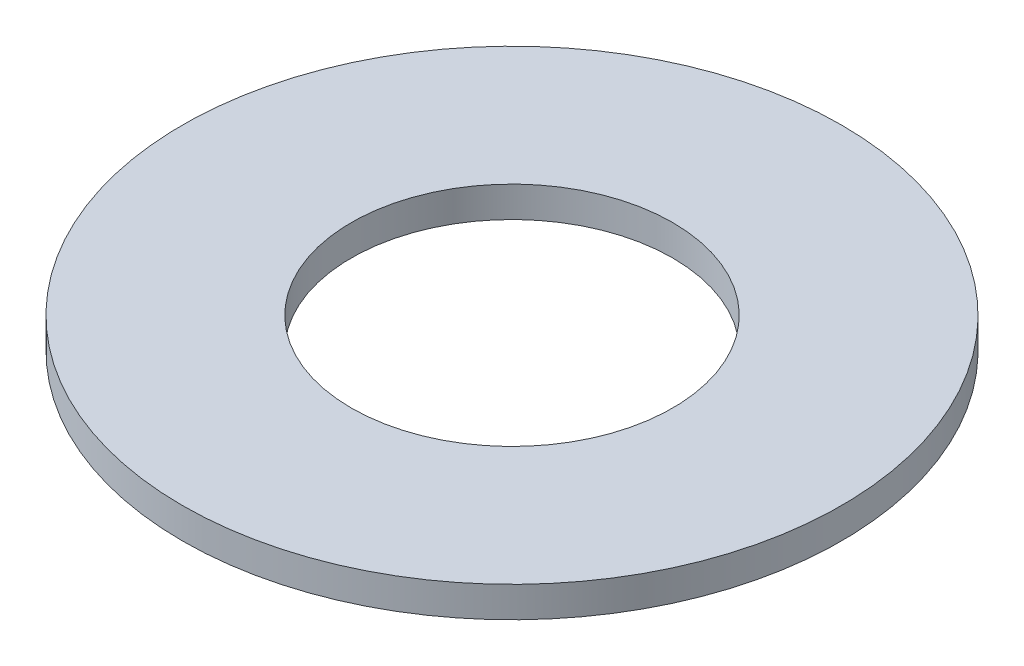
ISO-10303-21;
HEADER;
FILE_DESCRIPTION(('STEP AP214'),'2;1');
FILE_NAME('part.step','',(''),(''),'','','');
FILE_SCHEMA(('AUTOMOTIVE_DESIGN { 1 0 10303 214 1 1 1 1 }'));
ENDSEC;
DATA;
#1=APPLICATION_CONTEXT('core data for automotive mechanical design processes');
#2=APPLICATION_PROTOCOL_DEFINITION('international standard','automotive_design',2000,#1);
#3=PRODUCT_CONTEXT('',#1,'mechanical');
#4=PRODUCT('Part','Part','',(#3));
#5=PRODUCT_RELATED_PRODUCT_CATEGORY('part','',(#4));
#6=PRODUCT_DEFINITION_FORMATION('','',#4);
#7=PRODUCT_DEFINITION_CONTEXT('part definition',#1,'design');
#8=PRODUCT_DEFINITION('design','',#6,#7);
#9=PRODUCT_DEFINITION_SHAPE('','',#8);
#10=(LENGTH_UNIT() NAMED_UNIT(*) SI_UNIT(.MILLI.,.METRE.));
#11=(NAMED_UNIT(*) PLANE_ANGLE_UNIT() SI_UNIT($,.RADIAN.));
#12=(NAMED_UNIT(*) SI_UNIT($,.STERADIAN.) SOLID_ANGLE_UNIT());
#13=UNCERTAINTY_MEASURE_WITH_UNIT(LENGTH_MEASURE(1.E-05),#10,'distance_accuracy_value','');
#14=(GEOMETRIC_REPRESENTATION_CONTEXT(3) GLOBAL_UNCERTAINTY_ASSIGNED_CONTEXT((#13)) GLOBAL_UNIT_ASSIGNED_CONTEXT((#10,
#11,#12)) REPRESENTATION_CONTEXT('',''));
#15=CARTESIAN_POINT('',(0.,0.,0.));
#16=DIRECTION('',(0.,0.,1.));
#17=DIRECTION('',(1.,0.,0.));
#18=AXIS2_PLACEMENT_3D('',#15,#16,#17);
#19=CARTESIAN_POINT('',(0.,3.,0.));
#20=DIRECTION('',(0.,1.,0.));
#21=DIRECTION('',(0.,0.,1.));
#22=AXIS2_PLACEMENT_3D('',#19,#20,#21);
#23=PLANE('',#22);
#24=CARTESIAN_POINT('',(0.,3.,0.));
#25=DIRECTION('',(0.,1.,0.));
#26=DIRECTION('',(0.,0.,1.));
#27=AXIS2_PLACEMENT_3D('',#24,#25,#26);
#28=CIRCLE('',#27,32.2);
#29=CARTESIAN_POINT('',(0.,3.,32.2));
#30=VERTEX_POINT('',#29);
#31=EDGE_CURVE('E10',#30,#30,#28,.T.);
#32=ORIENTED_EDGE('',*,*,#31,.T.);
#33=EDGE_LOOP('',(#32));
#34=FACE_BOUND('',#33,.T.);
#35=CARTESIAN_POINT('',(0.,3.,0.));
#36=DIRECTION('',(0.,1.,0.));
#37=DIRECTION('',(0.,0.,1.));
#38=AXIS2_PLACEMENT_3D('',#35,#36,#37);
#39=CIRCLE('',#38,15.7);
#40=CARTESIAN_POINT('',(0.,3.,15.7));
#41=VERTEX_POINT('',#40);
#42=EDGE_CURVE('E42',#41,#41,#39,.T.);
#43=ORIENTED_EDGE('',*,*,#42,.F.);
#44=EDGE_LOOP('',(#43));
#45=FACE_BOUND('',#44,.T.);
#46=ADVANCED_FACE('F31',(#34,#45),#23,.T.);
#47=CARTESIAN_POINT('',(0.,0.,0.));
#48=DIRECTION('',(0.,1.,0.));
#49=DIRECTION('',(0.,0.,1.));
#50=AXIS2_PLACEMENT_3D('',#47,#48,#49);
#51=PLANE('',#50);
#52=CARTESIAN_POINT('',(0.,0.,0.));
#53=DIRECTION('',(0.,1.,0.));
#54=DIRECTION('',(0.,0.,1.));
#55=AXIS2_PLACEMENT_3D('',#52,#53,#54);
#56=CIRCLE('',#55,32.2);
#57=CARTESIAN_POINT('',(0.,0.,32.2));
#58=VERTEX_POINT('',#57);
#59=EDGE_CURVE('E35',#58,#58,#56,.T.);
#60=ORIENTED_EDGE('',*,*,#59,.F.);
#61=EDGE_LOOP('',(#60));
#62=FACE_BOUND('',#61,.T.);
#63=CARTESIAN_POINT('',(0.,0.,0.));
#64=DIRECTION('',(0.,1.,0.));
#65=DIRECTION('',(0.,0.,1.));
#66=AXIS2_PLACEMENT_3D('',#63,#64,#65);
#67=CIRCLE('',#66,15.7);
#68=CARTESIAN_POINT('',(0.,0.,15.7));
#69=VERTEX_POINT('',#68);
#70=EDGE_CURVE('E44',#69,#69,#67,.T.);
#71=ORIENTED_EDGE('',*,*,#70,.T.);
#72=EDGE_LOOP('',(#71));
#73=FACE_BOUND('',#72,.T.);
#74=ADVANCED_FACE('F54',(#62,#73),#51,.F.);
#75=CARTESIAN_POINT('',(0.,3.,0.));
#76=DIRECTION('',(0.,-1.,0.));
#77=DIRECTION('',(0.,0.,-1.));
#78=AXIS2_PLACEMENT_3D('',#75,#76,#77);
#79=CYLINDRICAL_SURFACE('',#78,32.2);
#80=ORIENTED_EDGE('',*,*,#31,.F.);
#81=EDGE_LOOP('',(#80));
#82=FACE_BOUND('',#81,.T.);
#83=ORIENTED_EDGE('',*,*,#59,.T.);
#84=EDGE_LOOP('',(#83));
#85=FACE_BOUND('',#84,.T.);
#86=ADVANCED_FACE('F33',(#82,#85),#79,.T.);
#87=CARTESIAN_POINT('',(0.,3.,0.));
#88=DIRECTION('',(0.,-1.,0.));
#89=DIRECTION('',(0.,0.,-1.));
#90=AXIS2_PLACEMENT_3D('',#87,#88,#89);
#91=CYLINDRICAL_SURFACE('',#90,15.7);
#92=ORIENTED_EDGE('',*,*,#42,.T.);
#93=EDGE_LOOP('',(#92));
#94=FACE_BOUND('',#93,.T.);
#95=ORIENTED_EDGE('',*,*,#70,.F.);
#96=EDGE_LOOP('',(#95));
#97=FACE_BOUND('',#96,.T.);
#98=ADVANCED_FACE('F50',(#94,#97),#91,.F.);
#99=CLOSED_SHELL('',(#46,#74,#86,#98));
#100=MANIFOLD_SOLID_BREP('B2',#99);
#101=ADVANCED_BREP_SHAPE_REPRESENTATION('',(#18,#100),#14);
#102=SHAPE_DEFINITION_REPRESENTATION(#9,#101);
ENDSEC;
END-ISO-10303-21;
